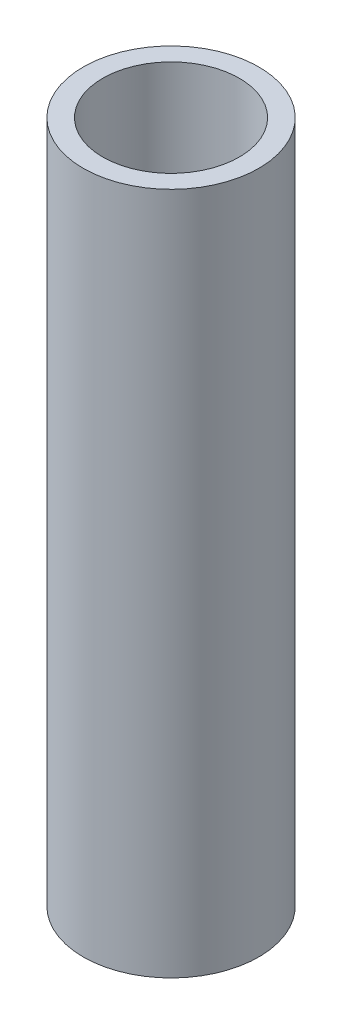
ISO-10303-21;
HEADER;
FILE_DESCRIPTION(('STEP AP214'),'2;1');
FILE_NAME('part.step','',(''),(''),'','','');
FILE_SCHEMA(('AUTOMOTIVE_DESIGN { 1 0 10303 214 1 1 1 1 }'));
ENDSEC;
DATA;
#1=APPLICATION_CONTEXT('core data for automotive mechanical design processes');
#2=APPLICATION_PROTOCOL_DEFINITION('international standard','automotive_design',2000,#1);
#3=PRODUCT_CONTEXT('',#1,'mechanical');
#4=PRODUCT('Part','Part','',(#3));
#5=PRODUCT_RELATED_PRODUCT_CATEGORY('part','',(#4));
#6=PRODUCT_DEFINITION_FORMATION('','',#4);
#7=PRODUCT_DEFINITION_CONTEXT('part definition',#1,'design');
#8=PRODUCT_DEFINITION('design','',#6,#7);
#9=PRODUCT_DEFINITION_SHAPE('','',#8);
#10=(LENGTH_UNIT() NAMED_UNIT(*) SI_UNIT(.MILLI.,.METRE.));
#11=(NAMED_UNIT(*) PLANE_ANGLE_UNIT() SI_UNIT($,.RADIAN.));
#12=(NAMED_UNIT(*) SI_UNIT($,.STERADIAN.) SOLID_ANGLE_UNIT());
#13=UNCERTAINTY_MEASURE_WITH_UNIT(LENGTH_MEASURE(1.E-05),#10,'distance_accuracy_value','');
#14=(GEOMETRIC_REPRESENTATION_CONTEXT(3) GLOBAL_UNCERTAINTY_ASSIGNED_CONTEXT((#13)) GLOBAL_UNIT_ASSIGNED_CONTEXT((#10,
#11,#12)) REPRESENTATION_CONTEXT('',''));
#15=CARTESIAN_POINT('',(0.,0.,0.));
#16=DIRECTION('',(0.,0.,1.));
#17=DIRECTION('',(1.,0.,0.));
#18=AXIS2_PLACEMENT_3D('',#15,#16,#17);
#19=CARTESIAN_POINT('',(0.,70.,0.));
#20=DIRECTION('',(0.,1.,0.));
#21=DIRECTION('',(0.,0.,1.));
#22=AXIS2_PLACEMENT_3D('',#19,#20,#21);
#23=PLANE('',#22);
#24=CARTESIAN_POINT('',(0.,70.,0.));
#25=DIRECTION('',(0.,1.,0.));
#26=DIRECTION('',(0.,0.,1.));
#27=AXIS2_PLACEMENT_3D('',#24,#25,#26);
#28=CIRCLE('',#27,9.);
#29=CARTESIAN_POINT('',(0.,70.,9.));
#30=VERTEX_POINT('',#29);
#31=EDGE_CURVE('E10',#30,#30,#28,.T.);
#32=ORIENTED_EDGE('',*,*,#31,.T.);
#33=EDGE_LOOP('',(#32));
#34=FACE_BOUND('',#33,.T.);
#35=CARTESIAN_POINT('',(0.,70.,0.));
#36=DIRECTION('',(0.,1.,0.));
#37=DIRECTION('',(0.,0.,1.));
#38=AXIS2_PLACEMENT_3D('',#35,#36,#37);
#39=CIRCLE('',#38,7.);
#40=CARTESIAN_POINT('',(0.,70.,7.));
#41=VERTEX_POINT('',#40);
#42=EDGE_CURVE('E43',#41,#41,#39,.T.);
#43=ORIENTED_EDGE('',*,*,#42,.F.);
#44=EDGE_LOOP('',(#43));
#45=FACE_BOUND('',#44,.T.);
#46=ADVANCED_FACE('F32',(#34,#45),#23,.T.);
#47=CARTESIAN_POINT('',(0.,0.,0.));
#48=DIRECTION('',(0.,1.,0.));
#49=DIRECTION('',(0.,0.,1.));
#50=AXIS2_PLACEMENT_3D('',#47,#48,#49);
#51=PLANE('',#50);
#52=CARTESIAN_POINT('',(0.,0.,0.));
#53=DIRECTION('',(0.,1.,0.));
#54=DIRECTION('',(0.,0.,1.));
#55=AXIS2_PLACEMENT_3D('',#52,#53,#54);
#56=CIRCLE('',#55,9.);
#57=CARTESIAN_POINT('',(0.,0.,9.));
#58=VERTEX_POINT('',#57);
#59=EDGE_CURVE('E36',#58,#58,#56,.T.);
#60=ORIENTED_EDGE('',*,*,#59,.F.);
#61=EDGE_LOOP('',(#60));
#62=FACE_BOUND('',#61,.T.);
#63=CARTESIAN_POINT('',(0.,0.,0.));
#64=DIRECTION('',(0.,1.,0.));
#65=DIRECTION('',(0.,0.,1.));
#66=AXIS2_PLACEMENT_3D('',#63,#64,#65);
#67=CIRCLE('',#66,7.);
#68=CARTESIAN_POINT('',(0.,0.,7.));
#69=VERTEX_POINT('',#68);
#70=EDGE_CURVE('E45',#69,#69,#67,.T.);
#71=ORIENTED_EDGE('',*,*,#70,.T.);
#72=EDGE_LOOP('',(#71));
#73=FACE_BOUND('',#72,.T.);
#74=ADVANCED_FACE('F55',(#62,#73),#51,.F.);
#75=CARTESIAN_POINT('',(0.,70.,0.));
#76=DIRECTION('',(0.,-1.,0.));
#77=DIRECTION('',(0.,0.,-1.));
#78=AXIS2_PLACEMENT_3D('',#75,#76,#77);
#79=CYLINDRICAL_SURFACE('',#78,9.);
#80=ORIENTED_EDGE('',*,*,#31,.F.);
#81=EDGE_LOOP('',(#80));
#82=FACE_BOUND('',#81,.T.);
#83=ORIENTED_EDGE('',*,*,#59,.T.);
#84=EDGE_LOOP('',(#83));
#85=FACE_BOUND('',#84,.T.);
#86=ADVANCED_FACE('F34',(#82,#85),#79,.T.);
#87=CARTESIAN_POINT('',(0.,70.,0.));
#88=DIRECTION('',(0.,-1.,0.));
#89=DIRECTION('',(0.,0.,-1.));
#90=AXIS2_PLACEMENT_3D('',#87,#88,#89);
#91=CYLINDRICAL_SURFACE('',#90,7.);
#92=ORIENTED_EDGE('',*,*,#42,.T.);
#93=EDGE_LOOP('',(#92));
#94=FACE_BOUND('',#93,.T.);
#95=ORIENTED_EDGE('',*,*,#70,.F.);
#96=EDGE_LOOP('',(#95));
#97=FACE_BOUND('',#96,.T.);
#98=ADVANCED_FACE('F51',(#94,#97),#91,.F.);
#99=CLOSED_SHELL('',(#46,#74,#86,#98));
#100=MANIFOLD_SOLID_BREP('B2',#99);
#101=ADVANCED_BREP_SHAPE_REPRESENTATION('',(#18,#100),#14);
#102=SHAPE_DEFINITION_REPRESENTATION(#9,#101);
ENDSEC;
END-ISO-10303-21;
